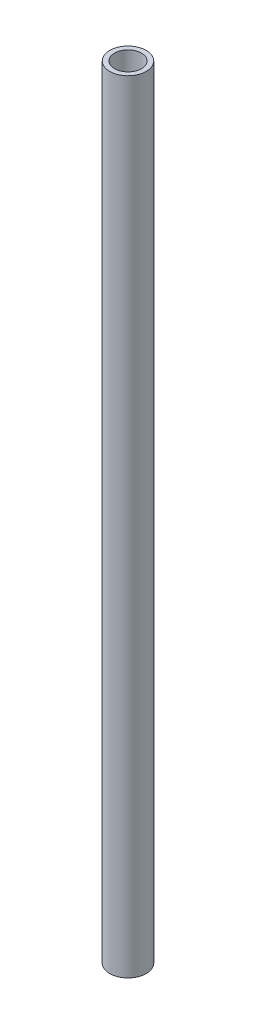
ISO-10303-21;
HEADER;
FILE_DESCRIPTION(('STEP AP214'),'2;1');
FILE_NAME('part.step','',(''),(''),'','','');
FILE_SCHEMA(('AUTOMOTIVE_DESIGN { 1 0 10303 214 1 1 1 1 }'));
ENDSEC;
DATA;
#1=APPLICATION_CONTEXT('core data for automotive mechanical design processes');
#2=APPLICATION_PROTOCOL_DEFINITION('international standard','automotive_design',2000,#1);
#3=PRODUCT_CONTEXT('',#1,'mechanical');
#4=PRODUCT('Part','Part','',(#3));
#5=PRODUCT_RELATED_PRODUCT_CATEGORY('part','',(#4));
#6=PRODUCT_DEFINITION_FORMATION('','',#4);
#7=PRODUCT_DEFINITION_CONTEXT('part definition',#1,'design');
#8=PRODUCT_DEFINITION('design','',#6,#7);
#9=PRODUCT_DEFINITION_SHAPE('','',#8);
#10=(LENGTH_UNIT() NAMED_UNIT(*) SI_UNIT(.MILLI.,.METRE.));
#11=(NAMED_UNIT(*) PLANE_ANGLE_UNIT() SI_UNIT($,.RADIAN.));
#12=(NAMED_UNIT(*) SI_UNIT($,.STERADIAN.) SOLID_ANGLE_UNIT());
#13=UNCERTAINTY_MEASURE_WITH_UNIT(LENGTH_MEASURE(1.E-05),#10,'distance_accuracy_value','');
#14=(GEOMETRIC_REPRESENTATION_CONTEXT(3) GLOBAL_UNCERTAINTY_ASSIGNED_CONTEXT((#13)) GLOBAL_UNIT_ASSIGNED_CONTEXT((#10,
#11,#12)) REPRESENTATION_CONTEXT('',''));
#15=CARTESIAN_POINT('',(0.,0.,0.));
#16=DIRECTION('',(0.,0.,1.));
#17=DIRECTION('',(1.,0.,0.));
#18=AXIS2_PLACEMENT_3D('',#15,#16,#17);
#19=CARTESIAN_POINT('',(0.,457.2,0.));
#20=DIRECTION('',(0.,1.,0.));
#21=DIRECTION('',(0.,0.,1.));
#22=AXIS2_PLACEMENT_3D('',#19,#20,#21);
#23=PLANE('',#22);
#24=CARTESIAN_POINT('',(0.,457.2,0.));
#25=DIRECTION('',(0.,1.,0.));
#26=DIRECTION('',(0.,0.,1.));
#27=AXIS2_PLACEMENT_3D('',#24,#25,#26);
#28=CIRCLE('',#27,10.668);
#29=CARTESIAN_POINT('',(0.,457.2,10.668));
#30=VERTEX_POINT('',#29);
#31=EDGE_CURVE('E10',#30,#30,#28,.T.);
#32=ORIENTED_EDGE('',*,*,#31,.T.);
#33=EDGE_LOOP('',(#32));
#34=FACE_BOUND('',#33,.T.);
#35=CARTESIAN_POINT('',(0.,457.2,0.));
#36=DIRECTION('',(0.,1.,0.));
#37=DIRECTION('',(0.,0.,1.));
#38=AXIS2_PLACEMENT_3D('',#35,#36,#37);
#39=CIRCLE('',#38,7.8994);
#40=CARTESIAN_POINT('',(0.,457.2,7.8994));
#41=VERTEX_POINT('',#40);
#42=EDGE_CURVE('E45',#41,#41,#39,.T.);
#43=ORIENTED_EDGE('',*,*,#42,.F.);
#44=EDGE_LOOP('',(#43));
#45=FACE_BOUND('',#44,.T.);
#46=ADVANCED_FACE('F34',(#34,#45),#23,.T.);
#47=CARTESIAN_POINT('',(0.,0.,0.));
#48=DIRECTION('',(0.,1.,0.));
#49=DIRECTION('',(0.,0.,1.));
#50=AXIS2_PLACEMENT_3D('',#47,#48,#49);
#51=PLANE('',#50);
#52=CARTESIAN_POINT('',(0.,0.,0.));
#53=DIRECTION('',(0.,1.,0.));
#54=DIRECTION('',(0.,0.,1.));
#55=AXIS2_PLACEMENT_3D('',#52,#53,#54);
#56=CIRCLE('',#55,10.668);
#57=CARTESIAN_POINT('',(0.,0.,10.668));
#58=VERTEX_POINT('',#57);
#59=EDGE_CURVE('E38',#58,#58,#56,.T.);
#60=ORIENTED_EDGE('',*,*,#59,.F.);
#61=EDGE_LOOP('',(#60));
#62=FACE_BOUND('',#61,.T.);
#63=CARTESIAN_POINT('',(0.,0.,0.));
#64=DIRECTION('',(0.,1.,0.));
#65=DIRECTION('',(0.,0.,1.));
#66=AXIS2_PLACEMENT_3D('',#63,#64,#65);
#67=CIRCLE('',#66,7.8994);
#68=CARTESIAN_POINT('',(0.,0.,7.8994));
#69=VERTEX_POINT('',#68);
#70=EDGE_CURVE('E47',#69,#69,#67,.T.);
#71=ORIENTED_EDGE('',*,*,#70,.T.);
#72=EDGE_LOOP('',(#71));
#73=FACE_BOUND('',#72,.T.);
#74=ADVANCED_FACE('F57',(#62,#73),#51,.F.);
#75=CARTESIAN_POINT('',(0.,457.2,0.));
#76=DIRECTION('',(0.,-1.,0.));
#77=DIRECTION('',(0.,0.,-1.));
#78=AXIS2_PLACEMENT_3D('',#75,#76,#77);
#79=CYLINDRICAL_SURFACE('',#78,10.668);
#80=ORIENTED_EDGE('',*,*,#31,.F.);
#81=EDGE_LOOP('',(#80));
#82=FACE_BOUND('',#81,.T.);
#83=ORIENTED_EDGE('',*,*,#59,.T.);
#84=EDGE_LOOP('',(#83));
#85=FACE_BOUND('',#84,.T.);
#86=ADVANCED_FACE('F36',(#82,#85),#79,.T.);
#87=CARTESIAN_POINT('',(0.,457.2,0.));
#88=DIRECTION('',(0.,-1.,0.));
#89=DIRECTION('',(0.,0.,-1.));
#90=AXIS2_PLACEMENT_3D('',#87,#88,#89);
#91=CYLINDRICAL_SURFACE('',#90,7.8994);
#92=ORIENTED_EDGE('',*,*,#42,.T.);
#93=EDGE_LOOP('',(#92));
#94=FACE_BOUND('',#93,.T.);
#95=ORIENTED_EDGE('',*,*,#70,.F.);
#96=EDGE_LOOP('',(#95));
#97=FACE_BOUND('',#96,.T.);
#98=ADVANCED_FACE('F53',(#94,#97),#91,.F.);
#99=CLOSED_SHELL('',(#46,#74,#86,#98));
#100=MANIFOLD_SOLID_BREP('B2',#99);
#101=ADVANCED_BREP_SHAPE_REPRESENTATION('',(#18,#100),#14);
#102=SHAPE_DEFINITION_REPRESENTATION(#9,#101);
ENDSEC;
END-ISO-10303-21;
